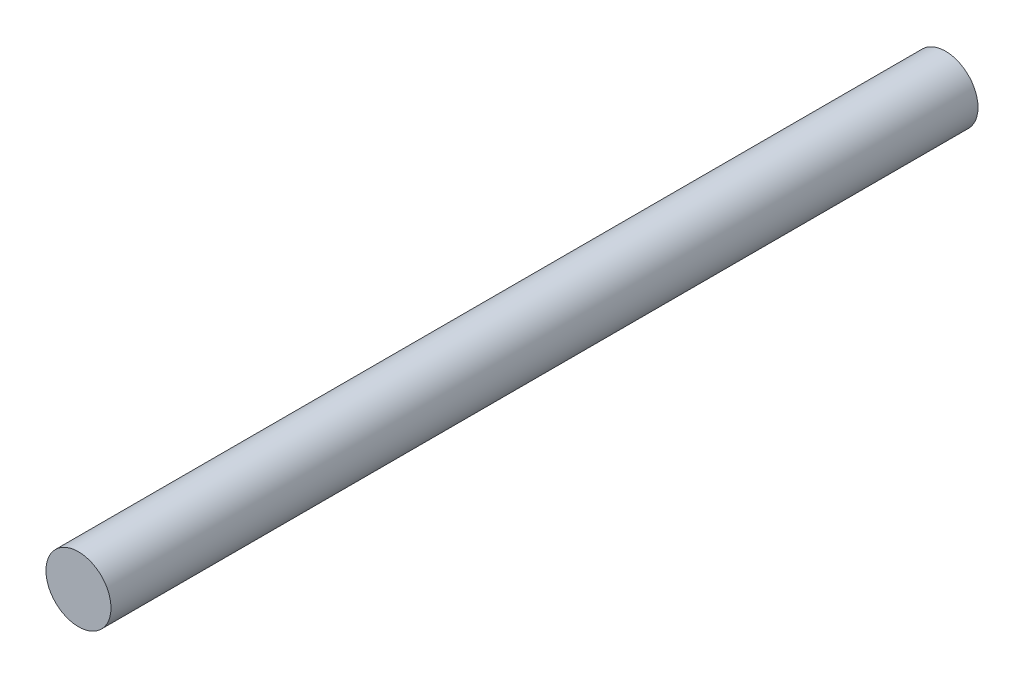
ISO-10303-21;
HEADER;
FILE_DESCRIPTION(('STEP AP214'),'2;1');
FILE_NAME('part.step','',(''),(''),'','','');
FILE_SCHEMA(('AUTOMOTIVE_DESIGN { 1 0 10303 214 1 1 1 1 }'));
ENDSEC;
DATA;
#1=APPLICATION_CONTEXT('core data for automotive mechanical design processes');
#2=APPLICATION_PROTOCOL_DEFINITION('international standard','automotive_design',2000,#1);
#3=PRODUCT_CONTEXT('',#1,'mechanical');
#4=PRODUCT('Part','Part','',(#3));
#5=PRODUCT_RELATED_PRODUCT_CATEGORY('part','',(#4));
#6=PRODUCT_DEFINITION_FORMATION('','',#4);
#7=PRODUCT_DEFINITION_CONTEXT('part definition',#1,'design');
#8=PRODUCT_DEFINITION('design','',#6,#7);
#9=PRODUCT_DEFINITION_SHAPE('','',#8);
#10=(LENGTH_UNIT() NAMED_UNIT(*) SI_UNIT(.MILLI.,.METRE.));
#11=(NAMED_UNIT(*) PLANE_ANGLE_UNIT() SI_UNIT($,.RADIAN.));
#12=(NAMED_UNIT(*) SI_UNIT($,.STERADIAN.) SOLID_ANGLE_UNIT());
#13=UNCERTAINTY_MEASURE_WITH_UNIT(LENGTH_MEASURE(1.E-05),#10,'distance_accuracy_value','');
#14=(GEOMETRIC_REPRESENTATION_CONTEXT(3) GLOBAL_UNCERTAINTY_ASSIGNED_CONTEXT((#13)) GLOBAL_UNIT_ASSIGNED_CONTEXT((#10,
#11,#12)) REPRESENTATION_CONTEXT('',''));
#15=CARTESIAN_POINT('',(0.,0.,0.));
#16=DIRECTION('',(0.,0.,1.));
#17=DIRECTION('',(1.,0.,0.));
#18=AXIS2_PLACEMENT_3D('',#15,#16,#17);
#19=CARTESIAN_POINT('',(0.,0.,-127.));
#20=DIRECTION('',(0.,0.,1.));
#21=DIRECTION('',(1.,0.,0.));
#22=AXIS2_PLACEMENT_3D('',#19,#20,#21);
#23=CYLINDRICAL_SURFACE('',#22,4.7625);
#24=CARTESIAN_POINT('',(0.,0.,-127.));
#25=DIRECTION('',(0.,0.,1.));
#26=DIRECTION('',(1.,0.,0.));
#27=AXIS2_PLACEMENT_3D('',#24,#25,#26);
#28=CIRCLE('',#27,4.7625);
#29=CARTESIAN_POINT('',(4.7625,0.,-127.));
#30=VERTEX_POINT('',#29);
#31=EDGE_CURVE('E10',#30,#30,#28,.T.);
#32=ORIENTED_EDGE('',*,*,#31,.T.);
#33=EDGE_LOOP('',(#32));
#34=FACE_BOUND('',#33,.T.);
#35=CARTESIAN_POINT('',(0.,0.,0.));
#36=DIRECTION('',(0.,0.,1.));
#37=DIRECTION('',(1.,0.,0.));
#38=AXIS2_PLACEMENT_3D('',#35,#36,#37);
#39=CIRCLE('',#38,4.7625);
#40=CARTESIAN_POINT('',(4.7625,0.,0.));
#41=VERTEX_POINT('',#40);
#42=EDGE_CURVE('E37',#41,#41,#39,.T.);
#43=ORIENTED_EDGE('',*,*,#42,.F.);
#44=EDGE_LOOP('',(#43));
#45=FACE_BOUND('',#44,.T.);
#46=ADVANCED_FACE('F34',(#34,#45),#23,.T.);
#47=CARTESIAN_POINT('',(0.,0.,-127.));
#48=DIRECTION('',(0.,0.,1.));
#49=DIRECTION('',(1.,0.,0.));
#50=AXIS2_PLACEMENT_3D('',#47,#48,#49);
#51=PLANE('',#50);
#52=ORIENTED_EDGE('',*,*,#31,.F.);
#53=EDGE_LOOP('',(#52));
#54=FACE_BOUND('',#53,.T.);
#55=ADVANCED_FACE('F49',(#54),#51,.F.);
#56=CARTESIAN_POINT('',(0.,0.,0.));
#57=DIRECTION('',(0.,0.,1.));
#58=DIRECTION('',(1.,0.,0.));
#59=AXIS2_PLACEMENT_3D('',#56,#57,#58);
#60=PLANE('',#59);
#61=ORIENTED_EDGE('',*,*,#42,.T.);
#62=EDGE_LOOP('',(#61));
#63=FACE_BOUND('',#62,.T.);
#64=ADVANCED_FACE('F46',(#63),#60,.T.);
#65=CLOSED_SHELL('',(#46,#55,#64));
#66=MANIFOLD_SOLID_BREP('B2',#65);
#67=ADVANCED_BREP_SHAPE_REPRESENTATION('',(#18,#66),#14);
#68=SHAPE_DEFINITION_REPRESENTATION(#9,#67);
ENDSEC;
END-ISO-10303-21;
